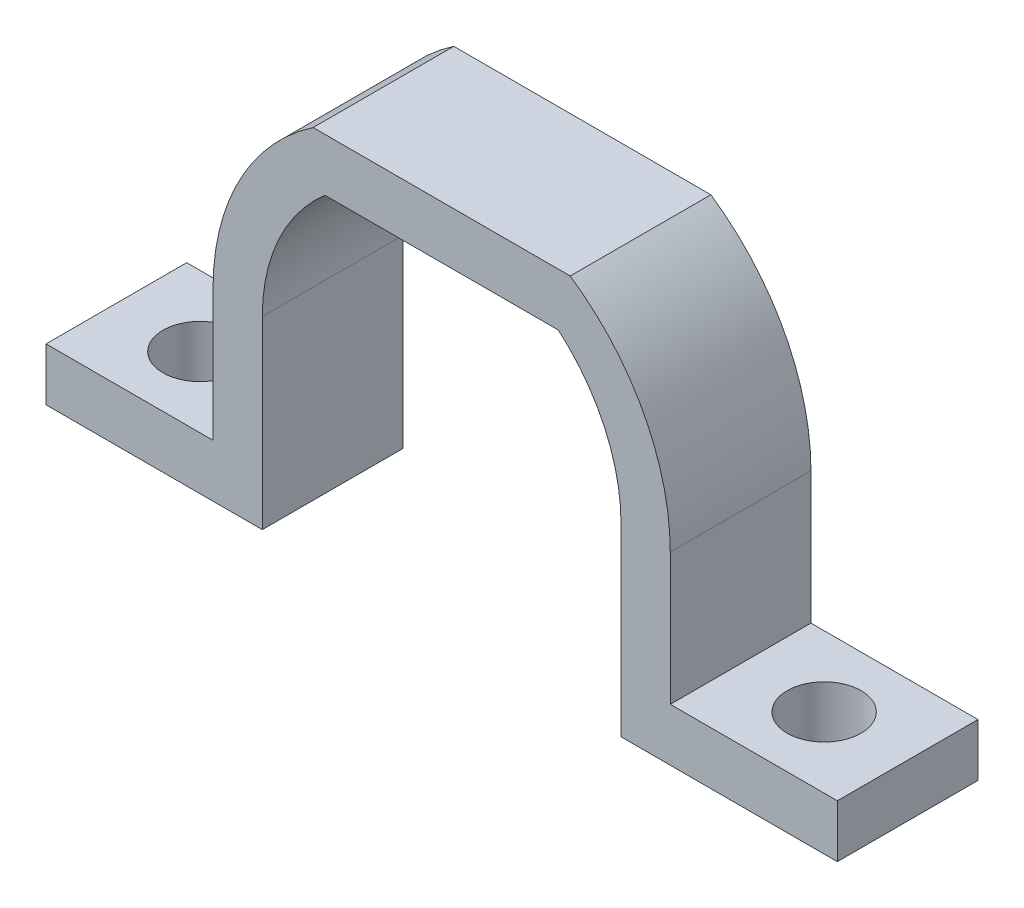
ISO-10303-21;
HEADER;
FILE_DESCRIPTION(('STEP AP214'),'2;1');
FILE_NAME('part.step','',(''),(''),'','','');
FILE_SCHEMA(('AUTOMOTIVE_DESIGN { 1 0 10303 214 1 1 1 1 }'));
ENDSEC;
DATA;
#1=APPLICATION_CONTEXT('core data for automotive mechanical design processes');
#2=APPLICATION_PROTOCOL_DEFINITION('international standard','automotive_design',2000,#1);
#3=PRODUCT_CONTEXT('',#1,'mechanical');
#4=PRODUCT('Part','Part','',(#3));
#5=PRODUCT_RELATED_PRODUCT_CATEGORY('part','',(#4));
#6=PRODUCT_DEFINITION_FORMATION('','',#4);
#7=PRODUCT_DEFINITION_CONTEXT('part definition',#1,'design');
#8=PRODUCT_DEFINITION('design','',#6,#7);
#9=PRODUCT_DEFINITION_SHAPE('','',#8);
#10=(LENGTH_UNIT() NAMED_UNIT(*) SI_UNIT(.MILLI.,.METRE.));
#11=(NAMED_UNIT(*) PLANE_ANGLE_UNIT() SI_UNIT($,.RADIAN.));
#12=(NAMED_UNIT(*) SI_UNIT($,.STERADIAN.) SOLID_ANGLE_UNIT());
#13=UNCERTAINTY_MEASURE_WITH_UNIT(LENGTH_MEASURE(1.E-05),#10,'distance_accuracy_value','');
#14=(GEOMETRIC_REPRESENTATION_CONTEXT(3) GLOBAL_UNCERTAINTY_ASSIGNED_CONTEXT((#13)) GLOBAL_UNIT_ASSIGNED_CONTEXT((#10,
#11,#12)) REPRESENTATION_CONTEXT('',''));
#15=CARTESIAN_POINT('',(0.,0.,0.));
#16=DIRECTION('',(0.,0.,1.));
#17=DIRECTION('',(1.,0.,0.));
#18=AXIS2_PLACEMENT_3D('',#15,#16,#17);
#19=CARTESIAN_POINT('',(0.,0.,8.));
#20=DIRECTION('',(0.,0.,-1.));
#21=DIRECTION('',(-1.,0.,0.));
#22=AXIS2_PLACEMENT_3D('',#19,#20,#21);
#23=CYLINDRICAL_SURFACE('',#22,10.2);
#24=CARTESIAN_POINT('',(0.,0.,0.));
#25=DIRECTION('',(0.,0.,-1.));
#26=DIRECTION('',(1.,0.,0.));
#27=AXIS2_PLACEMENT_3D('',#24,#25,#26);
#28=CIRCLE('',#27,10.2);
#29=CARTESIAN_POINT('',(-10.2,0.,0.));
#30=VERTEX_POINT('',#29);
#31=CARTESIAN_POINT('',(-6.63155336252374,7.75,0.));
#32=VERTEX_POINT('',#31);
#33=EDGE_CURVE('E183',#30,#32,#28,.T.);
#34=ORIENTED_EDGE('',*,*,#33,.T.);
#35=DIRECTION('',(0.,0.,-1.));
#36=VECTOR('',#35,1.);
#37=CARTESIAN_POINT('',(-6.63155336252374,7.75,8.));
#38=LINE('',#37,#36);
#39=CARTESIAN_POINT('',(-6.63155336252374,7.75,8.));
#40=VERTEX_POINT('',#39);
#41=EDGE_CURVE('E11',#40,#32,#38,.T.);
#42=ORIENTED_EDGE('',*,*,#41,.F.);
#43=CARTESIAN_POINT('',(0.,0.,8.));
#44=DIRECTION('',(0.,0.,-1.));
#45=DIRECTION('',(1.,0.,0.));
#46=AXIS2_PLACEMENT_3D('',#43,#44,#45);
#47=CIRCLE('',#46,10.2);
#48=CARTESIAN_POINT('',(-10.2,0.,8.));
#49=VERTEX_POINT('',#48);
#50=EDGE_CURVE('E214',#49,#40,#47,.T.);
#51=ORIENTED_EDGE('',*,*,#50,.F.);
#52=DIRECTION('',(0.,0.,-1.));
#53=VECTOR('',#52,1.);
#54=CARTESIAN_POINT('',(-10.2,0.,8.));
#55=LINE('',#54,#53);
#56=EDGE_CURVE('E179',#49,#30,#55,.T.);
#57=ORIENTED_EDGE('',*,*,#56,.T.);
#58=EDGE_LOOP('',(#34,#42,#51,#57));
#59=FACE_BOUND('',#58,.T.);
#60=ADVANCED_FACE('F39',(#59),#23,.F.);
#61=CARTESIAN_POINT('',(-6.63155336252374,7.75,8.));
#62=DIRECTION('',(0.,1.,0.));
#63=DIRECTION('',(0.,0.,1.));
#64=AXIS2_PLACEMENT_3D('',#61,#62,#63);
#65=PLANE('',#64);
#66=DIRECTION('',(1.,0.,0.));
#67=VECTOR('',#66,1.);
#68=CARTESIAN_POINT('',(-6.63155336252374,7.75,0.));
#69=LINE('',#68,#67);
#70=CARTESIAN_POINT('',(6.63155336252374,7.75,0.));
#71=VERTEX_POINT('',#70);
#72=EDGE_CURVE('E186',#32,#71,#69,.T.);
#73=ORIENTED_EDGE('',*,*,#72,.T.);
#74=DIRECTION('',(0.,0.,-1.));
#75=VECTOR('',#74,1.);
#76=CARTESIAN_POINT('',(6.63155336252374,7.75,8.));
#77=LINE('',#76,#75);
#78=CARTESIAN_POINT('',(6.63155336252374,7.75,8.));
#79=VERTEX_POINT('',#78);
#80=EDGE_CURVE('E47',#79,#71,#77,.T.);
#81=ORIENTED_EDGE('',*,*,#80,.F.);
#82=DIRECTION('',(1.,0.,0.));
#83=VECTOR('',#82,1.);
#84=CARTESIAN_POINT('',(-6.63155336252374,7.75,8.));
#85=LINE('',#84,#83);
#86=EDGE_CURVE('E122',#40,#79,#85,.T.);
#87=ORIENTED_EDGE('',*,*,#86,.F.);
#88=ORIENTED_EDGE('',*,*,#41,.T.);
#89=EDGE_LOOP('',(#73,#81,#87,#88));
#90=FACE_BOUND('',#89,.T.);
#91=ADVANCED_FACE('F314',(#90),#65,.F.);
#92=CARTESIAN_POINT('',(0.,0.,8.));
#93=DIRECTION('',(0.,0.,-1.));
#94=DIRECTION('',(-1.,0.,0.));
#95=AXIS2_PLACEMENT_3D('',#92,#93,#94);
#96=CYLINDRICAL_SURFACE('',#95,10.2);
#97=CARTESIAN_POINT('',(0.,0.,0.));
#98=DIRECTION('',(0.,0.,-1.));
#99=DIRECTION('',(1.,0.,0.));
#100=AXIS2_PLACEMENT_3D('',#97,#98,#99);
#101=CIRCLE('',#100,10.2);
#102=CARTESIAN_POINT('',(10.2,0.,0.));
#103=VERTEX_POINT('',#102);
#104=EDGE_CURVE('E189',#71,#103,#101,.T.);
#105=ORIENTED_EDGE('',*,*,#104,.T.);
#106=DIRECTION('',(0.,0.,-1.));
#107=VECTOR('',#106,1.);
#108=CARTESIAN_POINT('',(10.2,0.,8.));
#109=LINE('',#108,#107);
#110=CARTESIAN_POINT('',(10.2,0.,8.));
#111=VERTEX_POINT('',#110);
#112=EDGE_CURVE('E245',#111,#103,#109,.T.);
#113=ORIENTED_EDGE('',*,*,#112,.F.);
#114=CARTESIAN_POINT('',(0.,0.,8.));
#115=DIRECTION('',(0.,0.,-1.));
#116=DIRECTION('',(1.,0.,0.));
#117=AXIS2_PLACEMENT_3D('',#114,#115,#116);
#118=CIRCLE('',#117,10.2);
#119=EDGE_CURVE('E253',#79,#111,#118,.T.);
#120=ORIENTED_EDGE('',*,*,#119,.F.);
#121=ORIENTED_EDGE('',*,*,#80,.T.);
#122=EDGE_LOOP('',(#105,#113,#120,#121));
#123=FACE_BOUND('',#122,.T.);
#124=ADVANCED_FACE('F251',(#123),#96,.F.);
#125=CARTESIAN_POINT('',(10.2,0.,8.));
#126=DIRECTION('',(1.,0.,0.));
#127=DIRECTION('',(0.,1.,0.));
#128=AXIS2_PLACEMENT_3D('',#125,#126,#127);
#129=PLANE('',#128);
#130=DIRECTION('',(0.,-1.,0.));
#131=VECTOR('',#130,1.);
#132=CARTESIAN_POINT('',(10.2,0.,0.));
#133=LINE('',#132,#131);
#134=CARTESIAN_POINT('',(10.2,-10.5,0.));
#135=VERTEX_POINT('',#134);
#136=EDGE_CURVE('E191',#103,#135,#133,.T.);
#137=ORIENTED_EDGE('',*,*,#136,.T.);
#138=DIRECTION('',(0.,0.,-1.));
#139=VECTOR('',#138,1.);
#140=CARTESIAN_POINT('',(10.2,-10.5,8.));
#141=LINE('',#140,#139);
#142=CARTESIAN_POINT('',(10.2,-10.5,8.));
#143=VERTEX_POINT('',#142);
#144=EDGE_CURVE('E242',#143,#135,#141,.T.);
#145=ORIENTED_EDGE('',*,*,#144,.F.);
#146=DIRECTION('',(0.,-1.,0.));
#147=VECTOR('',#146,1.);
#148=CARTESIAN_POINT('',(10.2,0.,8.));
#149=LINE('',#148,#147);
#150=EDGE_CURVE('E271',#111,#143,#149,.T.);
#151=ORIENTED_EDGE('',*,*,#150,.F.);
#152=ORIENTED_EDGE('',*,*,#112,.T.);
#153=EDGE_LOOP('',(#137,#145,#151,#152));
#154=FACE_BOUND('',#153,.T.);
#155=ADVANCED_FACE('F262',(#154),#129,.F.);
#156=CARTESIAN_POINT('',(10.2,-10.5,8.));
#157=DIRECTION('',(0.,1.,0.));
#158=DIRECTION('',(0.,0.,1.));
#159=AXIS2_PLACEMENT_3D('',#156,#157,#158);
#160=PLANE('',#159);
#161=CARTESIAN_POINT('',(17.75,-10.5,4.));
#162=DIRECTION('',(0.,1.,0.));
#163=DIRECTION('',(0.,0.,1.));
#164=AXIS2_PLACEMENT_3D('',#161,#162,#163);
#165=CIRCLE('',#164,2.1);
#166=CARTESIAN_POINT('',(17.75,-10.5,6.1));
#167=VERTEX_POINT('',#166);
#168=EDGE_CURVE('E483',#167,#167,#165,.T.);
#169=ORIENTED_EDGE('',*,*,#168,.T.);
#170=EDGE_LOOP('',(#169));
#171=FACE_BOUND('',#170,.T.);
#172=DIRECTION('',(1.,0.,0.));
#173=VECTOR('',#172,1.);
#174=CARTESIAN_POINT('',(10.2,-10.5,0.));
#175=LINE('',#174,#173);
#176=CARTESIAN_POINT('',(22.5,-10.5,0.));
#177=VERTEX_POINT('',#176);
#178=EDGE_CURVE('E193',#135,#177,#175,.T.);
#179=ORIENTED_EDGE('',*,*,#178,.T.);
#180=DIRECTION('',(0.,0.,-1.));
#181=VECTOR('',#180,1.);
#182=CARTESIAN_POINT('',(22.5,-10.5,8.));
#183=LINE('',#182,#181);
#184=CARTESIAN_POINT('',(22.5,-10.5,8.));
#185=VERTEX_POINT('',#184);
#186=EDGE_CURVE('E239',#185,#177,#183,.T.);
#187=ORIENTED_EDGE('',*,*,#186,.F.);
#188=DIRECTION('',(1.,0.,0.));
#189=VECTOR('',#188,1.);
#190=CARTESIAN_POINT('',(10.2,-10.5,8.));
#191=LINE('',#190,#189);
#192=EDGE_CURVE('E268',#143,#185,#191,.T.);
#193=ORIENTED_EDGE('',*,*,#192,.F.);
#194=ORIENTED_EDGE('',*,*,#144,.T.);
#195=EDGE_LOOP('',(#179,#187,#193,#194));
#196=FACE_BOUND('',#195,.T.);
#197=ADVANCED_FACE('F266',(#171,#196),#160,.F.);
#198=CARTESIAN_POINT('',(22.5,-10.5,8.));
#199=DIRECTION('',(-1.,0.,0.));
#200=DIRECTION('',(0.,-1.,0.));
#201=AXIS2_PLACEMENT_3D('',#198,#199,#200);
#202=PLANE('',#201);
#203=DIRECTION('',(0.,1.,0.));
#204=VECTOR('',#203,1.);
#205=CARTESIAN_POINT('',(22.5,-10.5,0.));
#206=LINE('',#205,#204);
#207=CARTESIAN_POINT('',(22.5,-7.5,0.));
#208=VERTEX_POINT('',#207);
#209=EDGE_CURVE('E195',#177,#208,#206,.T.);
#210=ORIENTED_EDGE('',*,*,#209,.T.);
#211=DIRECTION('',(0.,0.,-1.));
#212=VECTOR('',#211,1.);
#213=CARTESIAN_POINT('',(22.5,-7.5,8.));
#214=LINE('',#213,#212);
#215=CARTESIAN_POINT('',(22.5,-7.5,8.));
#216=VERTEX_POINT('',#215);
#217=EDGE_CURVE('E236',#216,#208,#214,.T.);
#218=ORIENTED_EDGE('',*,*,#217,.F.);
#219=DIRECTION('',(0.,1.,0.));
#220=VECTOR('',#219,1.);
#221=CARTESIAN_POINT('',(22.5,-10.5,8.));
#222=LINE('',#221,#220);
#223=EDGE_CURVE('E270',#185,#216,#222,.T.);
#224=ORIENTED_EDGE('',*,*,#223,.F.);
#225=ORIENTED_EDGE('',*,*,#186,.T.);
#226=EDGE_LOOP('',(#210,#218,#224,#225));
#227=FACE_BOUND('',#226,.T.);
#228=ADVANCED_FACE('F327',(#227),#202,.F.);
#229=CARTESIAN_POINT('',(13.,-7.5,8.));
#230=DIRECTION('',(0.,-1.,0.));
#231=DIRECTION('',(0.,0.,-1.));
#232=AXIS2_PLACEMENT_3D('',#229,#230,#231);
#233=PLANE('',#232);
#234=CARTESIAN_POINT('',(17.75,-7.5,4.));
#235=DIRECTION('',(0.,1.,0.));
#236=DIRECTION('',(0.,0.,1.));
#237=AXIS2_PLACEMENT_3D('',#234,#235,#236);
#238=CIRCLE('',#237,2.1);
#239=CARTESIAN_POINT('',(17.75,-7.5,6.1));
#240=VERTEX_POINT('',#239);
#241=EDGE_CURVE('E486',#240,#240,#238,.T.);
#242=ORIENTED_EDGE('',*,*,#241,.F.);
#243=EDGE_LOOP('',(#242));
#244=FACE_BOUND('',#243,.T.);
#245=DIRECTION('',(-1.,0.,0.));
#246=VECTOR('',#245,1.);
#247=CARTESIAN_POINT('',(13.,-7.5,0.));
#248=LINE('',#247,#246);
#249=CARTESIAN_POINT('',(13.,-7.5,0.));
#250=VERTEX_POINT('',#249);
#251=EDGE_CURVE('E197',#208,#250,#248,.T.);
#252=ORIENTED_EDGE('',*,*,#251,.T.);
#253=DIRECTION('',(0.,0.,-1.));
#254=VECTOR('',#253,1.);
#255=CARTESIAN_POINT('',(13.,-7.5,8.));
#256=LINE('',#255,#254);
#257=CARTESIAN_POINT('',(13.,-7.5,8.));
#258=VERTEX_POINT('',#257);
#259=EDGE_CURVE('E233',#258,#250,#256,.T.);
#260=ORIENTED_EDGE('',*,*,#259,.F.);
#261=DIRECTION('',(-1.,0.,0.));
#262=VECTOR('',#261,1.);
#263=CARTESIAN_POINT('',(13.,-7.5,8.));
#264=LINE('',#263,#262);
#265=EDGE_CURVE('E273',#216,#258,#264,.T.);
#266=ORIENTED_EDGE('',*,*,#265,.F.);
#267=ORIENTED_EDGE('',*,*,#217,.T.);
#268=EDGE_LOOP('',(#252,#260,#266,#267));
#269=FACE_BOUND('',#268,.T.);
#270=ADVANCED_FACE('F331',(#244,#269),#233,.F.);
#271=CARTESIAN_POINT('',(13.,0.,8.));
#272=DIRECTION('',(-1.,0.,0.));
#273=DIRECTION('',(0.,0.,1.));
#274=AXIS2_PLACEMENT_3D('',#271,#272,#273);
#275=PLANE('',#274);
#276=DIRECTION('',(0.,1.,0.));
#277=VECTOR('',#276,1.);
#278=CARTESIAN_POINT('',(13.,0.,0.));
#279=LINE('',#278,#277);
#280=CARTESIAN_POINT('',(13.,0.,0.));
#281=VERTEX_POINT('',#280);
#282=EDGE_CURVE('E199',#250,#281,#279,.T.);
#283=ORIENTED_EDGE('',*,*,#282,.T.);
#284=DIRECTION('',(0.,0.,-1.));
#285=VECTOR('',#284,1.);
#286=CARTESIAN_POINT('',(13.,0.,8.));
#287=LINE('',#286,#285);
#288=CARTESIAN_POINT('',(13.,0.,8.));
#289=VERTEX_POINT('',#288);
#290=EDGE_CURVE('E230',#289,#281,#287,.T.);
#291=ORIENTED_EDGE('',*,*,#290,.F.);
#292=DIRECTION('',(0.,1.,0.));
#293=VECTOR('',#292,1.);
#294=CARTESIAN_POINT('',(13.,0.,8.));
#295=LINE('',#294,#293);
#296=EDGE_CURVE('E279',#258,#289,#295,.T.);
#297=ORIENTED_EDGE('',*,*,#296,.F.);
#298=ORIENTED_EDGE('',*,*,#259,.T.);
#299=EDGE_LOOP('',(#283,#291,#297,#298));
#300=FACE_BOUND('',#299,.T.);
#301=ADVANCED_FACE('F335',(#300),#275,.F.);
#302=CARTESIAN_POINT('',(0.,0.,8.));
#303=DIRECTION('',(0.,0.,-1.));
#304=DIRECTION('',(-1.,0.,0.));
#305=AXIS2_PLACEMENT_3D('',#302,#303,#304);
#306=CYLINDRICAL_SURFACE('',#305,13.);
#307=CARTESIAN_POINT('',(0.,0.,0.));
#308=DIRECTION('',(0.,0.,1.));
#309=DIRECTION('',(1.,0.,0.));
#310=AXIS2_PLACEMENT_3D('',#307,#308,#309);
#311=CIRCLE('',#310,13.);
#312=CARTESIAN_POINT('',(7.31009575860672,10.75,0.));
#313=VERTEX_POINT('',#312);
#314=EDGE_CURVE('E201',#281,#313,#311,.T.);
#315=ORIENTED_EDGE('',*,*,#314,.T.);
#316=DIRECTION('',(0.,0.,-1.));
#317=VECTOR('',#316,1.);
#318=CARTESIAN_POINT('',(7.31009575860672,10.75,8.));
#319=LINE('',#318,#317);
#320=CARTESIAN_POINT('',(7.31009575860672,10.75,8.));
#321=VERTEX_POINT('',#320);
#322=EDGE_CURVE('E227',#321,#313,#319,.T.);
#323=ORIENTED_EDGE('',*,*,#322,.F.);
#324=CARTESIAN_POINT('',(0.,0.,8.));
#325=DIRECTION('',(0.,0.,1.));
#326=DIRECTION('',(1.,0.,0.));
#327=AXIS2_PLACEMENT_3D('',#324,#325,#326);
#328=CIRCLE('',#327,13.);
#329=EDGE_CURVE('E281',#289,#321,#328,.T.);
#330=ORIENTED_EDGE('',*,*,#329,.F.);
#331=ORIENTED_EDGE('',*,*,#290,.T.);
#332=EDGE_LOOP('',(#315,#323,#330,#331));
#333=FACE_BOUND('',#332,.T.);
#334=ADVANCED_FACE('F339',(#333),#306,.T.);
#335=CARTESIAN_POINT('',(-7.31009575860672,10.75,8.));
#336=DIRECTION('',(0.,-1.,0.));
#337=DIRECTION('',(0.,0.,-1.));
#338=AXIS2_PLACEMENT_3D('',#335,#336,#337);
#339=PLANE('',#338);
#340=DIRECTION('',(-1.,0.,0.));
#341=VECTOR('',#340,1.);
#342=CARTESIAN_POINT('',(-7.31009575860672,10.75,0.));
#343=LINE('',#342,#341);
#344=CARTESIAN_POINT('',(-7.31009575860672,10.75,0.));
#345=VERTEX_POINT('',#344);
#346=EDGE_CURVE('E203',#313,#345,#343,.T.);
#347=ORIENTED_EDGE('',*,*,#346,.T.);
#348=DIRECTION('',(0.,0.,-1.));
#349=VECTOR('',#348,1.);
#350=CARTESIAN_POINT('',(-7.31009575860672,10.75,8.));
#351=LINE('',#350,#349);
#352=CARTESIAN_POINT('',(-7.31009575860672,10.75,8.));
#353=VERTEX_POINT('',#352);
#354=EDGE_CURVE('E224',#353,#345,#351,.T.);
#355=ORIENTED_EDGE('',*,*,#354,.F.);
#356=DIRECTION('',(-1.,0.,0.));
#357=VECTOR('',#356,1.);
#358=CARTESIAN_POINT('',(-7.31009575860672,10.75,8.));
#359=LINE('',#358,#357);
#360=EDGE_CURVE('E283',#321,#353,#359,.T.);
#361=ORIENTED_EDGE('',*,*,#360,.F.);
#362=ORIENTED_EDGE('',*,*,#322,.T.);
#363=EDGE_LOOP('',(#347,#355,#361,#362));
#364=FACE_BOUND('',#363,.T.);
#365=ADVANCED_FACE('F343',(#364),#339,.F.);
#366=CARTESIAN_POINT('',(0.,0.,8.));
#367=DIRECTION('',(0.,0.,-1.));
#368=DIRECTION('',(-1.,0.,0.));
#369=AXIS2_PLACEMENT_3D('',#366,#367,#368);
#370=CYLINDRICAL_SURFACE('',#369,13.);
#371=CARTESIAN_POINT('',(0.,0.,0.));
#372=DIRECTION('',(0.,0.,1.));
#373=DIRECTION('',(1.,0.,0.));
#374=AXIS2_PLACEMENT_3D('',#371,#372,#373);
#375=CIRCLE('',#374,13.);
#376=CARTESIAN_POINT('',(-13.,0.,0.));
#377=VERTEX_POINT('',#376);
#378=EDGE_CURVE('E205',#345,#377,#375,.T.);
#379=ORIENTED_EDGE('',*,*,#378,.T.);
#380=DIRECTION('',(0.,0.,-1.));
#381=VECTOR('',#380,1.);
#382=CARTESIAN_POINT('',(-13.,0.,8.));
#383=LINE('',#382,#381);
#384=CARTESIAN_POINT('',(-13.,0.,8.));
#385=VERTEX_POINT('',#384);
#386=EDGE_CURVE('E221',#385,#377,#383,.T.);
#387=ORIENTED_EDGE('',*,*,#386,.F.);
#388=CARTESIAN_POINT('',(0.,0.,8.));
#389=DIRECTION('',(0.,0.,1.));
#390=DIRECTION('',(1.,0.,0.));
#391=AXIS2_PLACEMENT_3D('',#388,#389,#390);
#392=CIRCLE('',#391,13.);
#393=EDGE_CURVE('E285',#353,#385,#392,.T.);
#394=ORIENTED_EDGE('',*,*,#393,.F.);
#395=ORIENTED_EDGE('',*,*,#354,.T.);
#396=EDGE_LOOP('',(#379,#387,#394,#395));
#397=FACE_BOUND('',#396,.T.);
#398=ADVANCED_FACE('F347',(#397),#370,.T.);
#399=CARTESIAN_POINT('',(-13.,0.,8.));
#400=DIRECTION('',(1.,0.,0.));
#401=DIRECTION('',(0.,0.,-1.));
#402=AXIS2_PLACEMENT_3D('',#399,#400,#401);
#403=PLANE('',#402);
#404=DIRECTION('',(0.,-1.,0.));
#405=VECTOR('',#404,1.);
#406=CARTESIAN_POINT('',(-13.,0.,0.));
#407=LINE('',#406,#405);
#408=CARTESIAN_POINT('',(-13.,-7.5,0.));
#409=VERTEX_POINT('',#408);
#410=EDGE_CURVE('E207',#377,#409,#407,.T.);
#411=ORIENTED_EDGE('',*,*,#410,.T.);
#412=DIRECTION('',(0.,0.,-1.));
#413=VECTOR('',#412,1.);
#414=CARTESIAN_POINT('',(-13.,-7.5,8.));
#415=LINE('',#414,#413);
#416=CARTESIAN_POINT('',(-13.,-7.5,8.));
#417=VERTEX_POINT('',#416);
#418=EDGE_CURVE('E218',#417,#409,#415,.T.);
#419=ORIENTED_EDGE('',*,*,#418,.F.);
#420=DIRECTION('',(0.,-1.,0.));
#421=VECTOR('',#420,1.);
#422=CARTESIAN_POINT('',(-13.,0.,8.));
#423=LINE('',#422,#421);
#424=EDGE_CURVE('E287',#385,#417,#423,.T.);
#425=ORIENTED_EDGE('',*,*,#424,.F.);
#426=ORIENTED_EDGE('',*,*,#386,.T.);
#427=EDGE_LOOP('',(#411,#419,#425,#426));
#428=FACE_BOUND('',#427,.T.);
#429=ADVANCED_FACE('F293',(#428),#403,.F.);
#430=CARTESIAN_POINT('',(-13.,-7.5,8.));
#431=DIRECTION('',(0.,-1.,0.));
#432=DIRECTION('',(0.,0.,-1.));
#433=AXIS2_PLACEMENT_3D('',#430,#431,#432);
#434=PLANE('',#433);
#435=CARTESIAN_POINT('',(-17.75,-7.5,4.));
#436=DIRECTION('',(0.,1.,0.));
#437=DIRECTION('',(0.,0.,1.));
#438=AXIS2_PLACEMENT_3D('',#435,#436,#437);
#439=CIRCLE('',#438,2.1);
#440=CARTESIAN_POINT('',(-17.75,-7.5,6.1));
#441=VERTEX_POINT('',#440);
#442=EDGE_CURVE('E487',#441,#441,#439,.T.);
#443=ORIENTED_EDGE('',*,*,#442,.F.);
#444=EDGE_LOOP('',(#443));
#445=FACE_BOUND('',#444,.T.);
#446=DIRECTION('',(-1.,0.,0.));
#447=VECTOR('',#446,1.);
#448=CARTESIAN_POINT('',(-13.,-7.5,0.));
#449=LINE('',#448,#447);
#450=CARTESIAN_POINT('',(-22.5,-7.5,0.));
#451=VERTEX_POINT('',#450);
#452=EDGE_CURVE('E209',#409,#451,#449,.T.);
#453=ORIENTED_EDGE('',*,*,#452,.T.);
#454=DIRECTION('',(0.,0.,-1.));
#455=VECTOR('',#454,1.);
#456=CARTESIAN_POINT('',(-22.5,-7.5,8.));
#457=LINE('',#456,#455);
#458=CARTESIAN_POINT('',(-22.5,-7.5,8.));
#459=VERTEX_POINT('',#458);
#460=EDGE_CURVE('E174',#459,#451,#457,.T.);
#461=ORIENTED_EDGE('',*,*,#460,.F.);
#462=DIRECTION('',(-1.,0.,0.));
#463=VECTOR('',#462,1.);
#464=CARTESIAN_POINT('',(-13.,-7.5,8.));
#465=LINE('',#464,#463);
#466=EDGE_CURVE('E165',#417,#459,#465,.T.);
#467=ORIENTED_EDGE('',*,*,#466,.F.);
#468=ORIENTED_EDGE('',*,*,#418,.T.);
#469=EDGE_LOOP('',(#453,#461,#467,#468));
#470=FACE_BOUND('',#469,.T.);
#471=ADVANCED_FACE('F297',(#445,#470),#434,.F.);
#472=CARTESIAN_POINT('',(-22.5,-7.5,8.));
#473=DIRECTION('',(1.,0.,0.));
#474=DIRECTION('',(0.,1.,0.));
#475=AXIS2_PLACEMENT_3D('',#472,#473,#474);
#476=PLANE('',#475);
#477=DIRECTION('',(0.,-1.,0.));
#478=VECTOR('',#477,1.);
#479=CARTESIAN_POINT('',(-22.5,-7.5,0.));
#480=LINE('',#479,#478);
#481=CARTESIAN_POINT('',(-22.5,-10.5,0.));
#482=VERTEX_POINT('',#481);
#483=EDGE_CURVE('E173',#451,#482,#480,.T.);
#484=ORIENTED_EDGE('',*,*,#483,.T.);
#485=DIRECTION('',(0.,0.,-1.));
#486=VECTOR('',#485,1.);
#487=CARTESIAN_POINT('',(-22.5,-10.5,8.));
#488=LINE('',#487,#486);
#489=CARTESIAN_POINT('',(-22.5,-10.5,8.));
#490=VERTEX_POINT('',#489);
#491=EDGE_CURVE('E170',#490,#482,#488,.T.);
#492=ORIENTED_EDGE('',*,*,#491,.F.);
#493=DIRECTION('',(0.,-1.,0.));
#494=VECTOR('',#493,1.);
#495=CARTESIAN_POINT('',(-22.5,-7.5,8.));
#496=LINE('',#495,#494);
#497=EDGE_CURVE('E159',#459,#490,#496,.T.);
#498=ORIENTED_EDGE('',*,*,#497,.F.);
#499=ORIENTED_EDGE('',*,*,#460,.T.);
#500=EDGE_LOOP('',(#484,#492,#498,#499));
#501=FACE_BOUND('',#500,.T.);
#502=ADVANCED_FACE('F171',(#501),#476,.F.);
#503=CARTESIAN_POINT('',(-22.5,-10.5,8.));
#504=DIRECTION('',(0.,1.,0.));
#505=DIRECTION('',(0.,0.,1.));
#506=AXIS2_PLACEMENT_3D('',#503,#504,#505);
#507=PLANE('',#506);
#508=CARTESIAN_POINT('',(-17.75,-10.5,4.));
#509=DIRECTION('',(0.,1.,0.));
#510=DIRECTION('',(0.,0.,1.));
#511=AXIS2_PLACEMENT_3D('',#508,#509,#510);
#512=CIRCLE('',#511,2.1);
#513=CARTESIAN_POINT('',(-17.75,-10.5,6.1));
#514=VERTEX_POINT('',#513);
#515=EDGE_CURVE('E187',#514,#514,#512,.T.);
#516=ORIENTED_EDGE('',*,*,#515,.T.);
#517=EDGE_LOOP('',(#516));
#518=FACE_BOUND('',#517,.T.);
#519=DIRECTION('',(1.,0.,0.));
#520=VECTOR('',#519,1.);
#521=CARTESIAN_POINT('',(-22.5,-10.5,0.));
#522=LINE('',#521,#520);
#523=CARTESIAN_POINT('',(-10.2,-10.5,0.));
#524=VERTEX_POINT('',#523);
#525=EDGE_CURVE('E108',#482,#524,#522,.T.);
#526=ORIENTED_EDGE('',*,*,#525,.T.);
#527=DIRECTION('',(0.,0.,-1.));
#528=VECTOR('',#527,1.);
#529=CARTESIAN_POINT('',(-10.2,-10.5,8.));
#530=LINE('',#529,#528);
#531=CARTESIAN_POINT('',(-10.2,-10.5,8.));
#532=VERTEX_POINT('',#531);
#533=EDGE_CURVE('E175',#532,#524,#530,.T.);
#534=ORIENTED_EDGE('',*,*,#533,.F.);
#535=DIRECTION('',(1.,0.,0.));
#536=VECTOR('',#535,1.);
#537=CARTESIAN_POINT('',(-22.5,-10.5,8.));
#538=LINE('',#537,#536);
#539=EDGE_CURVE('E163',#490,#532,#538,.T.);
#540=ORIENTED_EDGE('',*,*,#539,.F.);
#541=ORIENTED_EDGE('',*,*,#491,.T.);
#542=EDGE_LOOP('',(#526,#534,#540,#541));
#543=FACE_BOUND('',#542,.T.);
#544=ADVANCED_FACE('F177',(#518,#543),#507,.F.);
#545=CARTESIAN_POINT('',(-10.2,0.,8.));
#546=DIRECTION('',(-1.,0.,0.));
#547=DIRECTION('',(0.,0.,1.));
#548=AXIS2_PLACEMENT_3D('',#545,#546,#547);
#549=PLANE('',#548);
#550=DIRECTION('',(0.,1.,0.));
#551=VECTOR('',#550,1.);
#552=CARTESIAN_POINT('',(-10.2,0.,0.));
#553=LINE('',#552,#551);
#554=EDGE_CURVE('E114',#524,#30,#553,.T.);
#555=ORIENTED_EDGE('',*,*,#554,.T.);
#556=ORIENTED_EDGE('',*,*,#56,.F.);
#557=DIRECTION('',(0.,1.,0.));
#558=VECTOR('',#557,1.);
#559=CARTESIAN_POINT('',(-10.2,0.,8.));
#560=LINE('',#559,#558);
#561=EDGE_CURVE('E55',#532,#49,#560,.T.);
#562=ORIENTED_EDGE('',*,*,#561,.F.);
#563=ORIENTED_EDGE('',*,*,#533,.T.);
#564=EDGE_LOOP('',(#555,#556,#562,#563));
#565=FACE_BOUND('',#564,.T.);
#566=ADVANCED_FACE('F301',(#565),#549,.F.);
#567=CARTESIAN_POINT('',(0.,0.,8.));
#568=DIRECTION('',(0.,0.,1.));
#569=DIRECTION('',(1.,0.,0.));
#570=AXIS2_PLACEMENT_3D('',#567,#568,#569);
#571=PLANE('',#570);
#572=ORIENTED_EDGE('',*,*,#50,.T.);
#573=ORIENTED_EDGE('',*,*,#86,.T.);
#574=ORIENTED_EDGE('',*,*,#119,.T.);
#575=ORIENTED_EDGE('',*,*,#150,.T.);
#576=ORIENTED_EDGE('',*,*,#192,.T.);
#577=ORIENTED_EDGE('',*,*,#223,.T.);
#578=ORIENTED_EDGE('',*,*,#265,.T.);
#579=ORIENTED_EDGE('',*,*,#296,.T.);
#580=ORIENTED_EDGE('',*,*,#329,.T.);
#581=ORIENTED_EDGE('',*,*,#360,.T.);
#582=ORIENTED_EDGE('',*,*,#393,.T.);
#583=ORIENTED_EDGE('',*,*,#424,.T.);
#584=ORIENTED_EDGE('',*,*,#466,.T.);
#585=ORIENTED_EDGE('',*,*,#497,.T.);
#586=ORIENTED_EDGE('',*,*,#539,.T.);
#587=ORIENTED_EDGE('',*,*,#561,.T.);
#588=EDGE_LOOP('',(#572,#573,#574,#575,#576,#577,#578,#579,#580,#581,#582,#583,#584,#585,#586,#587));
#589=FACE_BOUND('',#588,.T.);
#590=ADVANCED_FACE('F161',(#589),#571,.T.);
#591=CARTESIAN_POINT('',(0.,0.,0.));
#592=DIRECTION('',(0.,0.,1.));
#593=DIRECTION('',(1.,0.,0.));
#594=AXIS2_PLACEMENT_3D('',#591,#592,#593);
#595=PLANE('',#594);
#596=ORIENTED_EDGE('',*,*,#33,.F.);
#597=ORIENTED_EDGE('',*,*,#554,.F.);
#598=ORIENTED_EDGE('',*,*,#525,.F.);
#599=ORIENTED_EDGE('',*,*,#483,.F.);
#600=ORIENTED_EDGE('',*,*,#452,.F.);
#601=ORIENTED_EDGE('',*,*,#410,.F.);
#602=ORIENTED_EDGE('',*,*,#378,.F.);
#603=ORIENTED_EDGE('',*,*,#346,.F.);
#604=ORIENTED_EDGE('',*,*,#314,.F.);
#605=ORIENTED_EDGE('',*,*,#282,.F.);
#606=ORIENTED_EDGE('',*,*,#251,.F.);
#607=ORIENTED_EDGE('',*,*,#209,.F.);
#608=ORIENTED_EDGE('',*,*,#178,.F.);
#609=ORIENTED_EDGE('',*,*,#136,.F.);
#610=ORIENTED_EDGE('',*,*,#104,.F.);
#611=ORIENTED_EDGE('',*,*,#72,.F.);
#612=EDGE_LOOP('',(#596,#597,#598,#599,#600,#601,#602,#603,#604,#605,#606,#607,#608,#609,#610,#611));
#613=FACE_BOUND('',#612,.T.);
#614=ADVANCED_FACE('F257',(#613),#595,.F.);
#615=CARTESIAN_POINT('',(-17.75,-10.5,4.));
#616=DIRECTION('',(0.,1.,0.));
#617=DIRECTION('',(0.,0.,1.));
#618=AXIS2_PLACEMENT_3D('',#615,#616,#617);
#619=CYLINDRICAL_SURFACE('',#618,2.1);
#620=ORIENTED_EDGE('',*,*,#515,.F.);
#621=EDGE_LOOP('',(#620));
#622=FACE_BOUND('',#621,.T.);
#623=ORIENTED_EDGE('',*,*,#442,.T.);
#624=EDGE_LOOP('',(#623));
#625=FACE_BOUND('',#624,.T.);
#626=ADVANCED_FACE('F453',(#622,#625),#619,.F.);
#627=CARTESIAN_POINT('',(17.75,-10.5,4.));
#628=DIRECTION('',(0.,1.,0.));
#629=DIRECTION('',(0.,0.,1.));
#630=AXIS2_PLACEMENT_3D('',#627,#628,#629);
#631=CYLINDRICAL_SURFACE('',#630,2.1);
#632=ORIENTED_EDGE('',*,*,#168,.F.);
#633=EDGE_LOOP('',(#632));
#634=FACE_BOUND('',#633,.T.);
#635=ORIENTED_EDGE('',*,*,#241,.T.);
#636=EDGE_LOOP('',(#635));
#637=FACE_BOUND('',#636,.T.);
#638=ADVANCED_FACE('F460',(#634,#637),#631,.F.);
#639=CLOSED_SHELL('',(#60,#91,#124,#155,#197,#228,#270,#301,#334,#365,#398,#429,#471,#502,#544,
#566,#590,#614,#626,#638));
#640=MANIFOLD_SOLID_BREP('B2',#639);
#641=ADVANCED_BREP_SHAPE_REPRESENTATION('',(#18,#640),#14);
#642=SHAPE_DEFINITION_REPRESENTATION(#9,#641);
ENDSEC;
END-ISO-10303-21;
